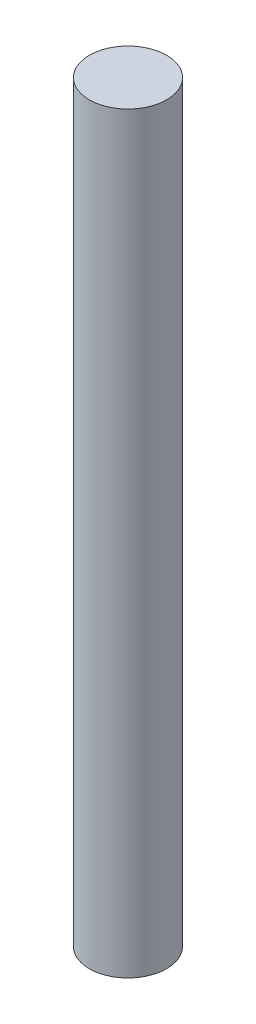
ISO-10303-21;
HEADER;
FILE_DESCRIPTION(('STEP AP214'),'2;1');
FILE_NAME('part.step','',(''),(''),'','','');
FILE_SCHEMA(('AUTOMOTIVE_DESIGN { 1 0 10303 214 1 1 1 1 }'));
ENDSEC;
DATA;
#1=APPLICATION_CONTEXT('core data for automotive mechanical design processes');
#2=APPLICATION_PROTOCOL_DEFINITION('international standard','automotive_design',2000,#1);
#3=PRODUCT_CONTEXT('',#1,'mechanical');
#4=PRODUCT('Part','Part','',(#3));
#5=PRODUCT_RELATED_PRODUCT_CATEGORY('part','',(#4));
#6=PRODUCT_DEFINITION_FORMATION('','',#4);
#7=PRODUCT_DEFINITION_CONTEXT('part definition',#1,'design');
#8=PRODUCT_DEFINITION('design','',#6,#7);
#9=PRODUCT_DEFINITION_SHAPE('','',#8);
#10=(LENGTH_UNIT() NAMED_UNIT(*) SI_UNIT(.MILLI.,.METRE.));
#11=(NAMED_UNIT(*) PLANE_ANGLE_UNIT() SI_UNIT($,.RADIAN.));
#12=(NAMED_UNIT(*) SI_UNIT($,.STERADIAN.) SOLID_ANGLE_UNIT());
#13=UNCERTAINTY_MEASURE_WITH_UNIT(LENGTH_MEASURE(1.E-05),#10,'distance_accuracy_value','');
#14=(GEOMETRIC_REPRESENTATION_CONTEXT(3) GLOBAL_UNCERTAINTY_ASSIGNED_CONTEXT((#13)) GLOBAL_UNIT_ASSIGNED_CONTEXT((#10,
#11,#12)) REPRESENTATION_CONTEXT('',''));
#15=CARTESIAN_POINT('',(0.,0.,0.));
#16=DIRECTION('',(0.,0.,1.));
#17=DIRECTION('',(1.,0.,0.));
#18=AXIS2_PLACEMENT_3D('',#15,#16,#17);
#19=CARTESIAN_POINT('',(0.,48.699999882,0.));
#20=DIRECTION('',(0.,-1.,0.));
#21=DIRECTION('',(0.,0.,-1.));
#22=AXIS2_PLACEMENT_3D('',#19,#20,#21);
#23=CYLINDRICAL_SURFACE('',#22,2.5);
#24=CARTESIAN_POINT('',(0.,48.699999882,0.));
#25=DIRECTION('',(0.,1.,0.));
#26=DIRECTION('',(0.,0.,1.));
#27=AXIS2_PLACEMENT_3D('',#24,#25,#26);
#28=CIRCLE('',#27,2.5);
#29=CARTESIAN_POINT('',(0.,48.699999882,2.5));
#30=VERTEX_POINT('',#29);
#31=EDGE_CURVE('E10',#30,#30,#28,.T.);
#32=ORIENTED_EDGE('',*,*,#31,.F.);
#33=EDGE_LOOP('',(#32));
#34=FACE_BOUND('',#33,.T.);
#35=CARTESIAN_POINT('',(0.,0.,0.));
#36=DIRECTION('',(0.,1.,0.));
#37=DIRECTION('',(0.,0.,1.));
#38=AXIS2_PLACEMENT_3D('',#35,#36,#37);
#39=CIRCLE('',#38,2.5);
#40=CARTESIAN_POINT('',(0.,0.,2.5));
#41=VERTEX_POINT('',#40);
#42=EDGE_CURVE('E34',#41,#41,#39,.T.);
#43=ORIENTED_EDGE('',*,*,#42,.T.);
#44=EDGE_LOOP('',(#43));
#45=FACE_BOUND('',#44,.T.);
#46=ADVANCED_FACE('F31',(#34,#45),#23,.T.);
#47=CARTESIAN_POINT('',(0.,48.699999882,0.));
#48=DIRECTION('',(0.,1.,0.));
#49=DIRECTION('',(0.,0.,1.));
#50=AXIS2_PLACEMENT_3D('',#47,#48,#49);
#51=PLANE('',#50);
#52=ORIENTED_EDGE('',*,*,#31,.T.);
#53=EDGE_LOOP('',(#52));
#54=FACE_BOUND('',#53,.T.);
#55=ADVANCED_FACE('F46',(#54),#51,.T.);
#56=CARTESIAN_POINT('',(0.,0.,0.));
#57=DIRECTION('',(0.,1.,0.));
#58=DIRECTION('',(0.,0.,1.));
#59=AXIS2_PLACEMENT_3D('',#56,#57,#58);
#60=PLANE('',#59);
#61=ORIENTED_EDGE('',*,*,#42,.F.);
#62=EDGE_LOOP('',(#61));
#63=FACE_BOUND('',#62,.T.);
#64=ADVANCED_FACE('F44',(#63),#60,.F.);
#65=CLOSED_SHELL('',(#46,#55,#64));
#66=MANIFOLD_SOLID_BREP('B2',#65);
#67=ADVANCED_BREP_SHAPE_REPRESENTATION('',(#18,#66),#14);
#68=SHAPE_DEFINITION_REPRESENTATION(#9,#67);
ENDSEC;
END-ISO-10303-21;
